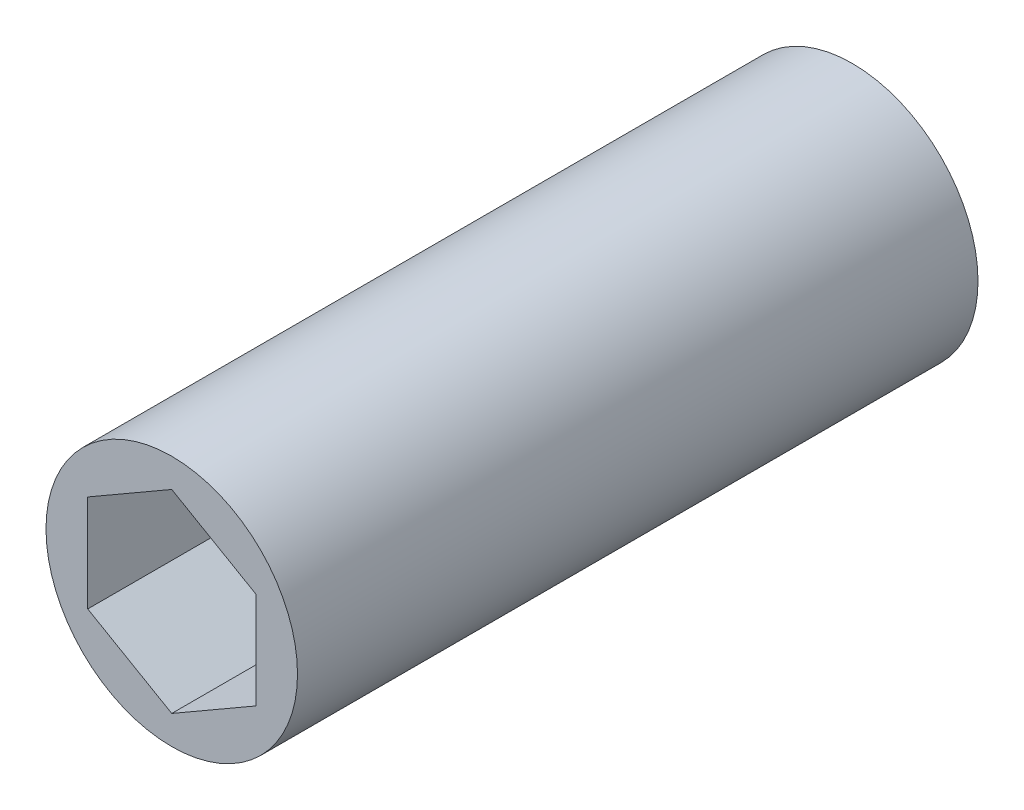
ISO-10303-21;
HEADER;
FILE_DESCRIPTION(('STEP AP214'),'2;1');
FILE_NAME('part.step','',(''),(''),'','','');
FILE_SCHEMA(('AUTOMOTIVE_DESIGN { 1 0 10303 214 1 1 1 1 }'));
ENDSEC;
DATA;
#1=APPLICATION_CONTEXT('core data for automotive mechanical design processes');
#2=APPLICATION_PROTOCOL_DEFINITION('international standard','automotive_design',2000,#1);
#3=PRODUCT_CONTEXT('',#1,'mechanical');
#4=PRODUCT('Part','Part','',(#3));
#5=PRODUCT_RELATED_PRODUCT_CATEGORY('part','',(#4));
#6=PRODUCT_DEFINITION_FORMATION('','',#4);
#7=PRODUCT_DEFINITION_CONTEXT('part definition',#1,'design');
#8=PRODUCT_DEFINITION('design','',#6,#7);
#9=PRODUCT_DEFINITION_SHAPE('','',#8);
#10=(LENGTH_UNIT() NAMED_UNIT(*) SI_UNIT(.MILLI.,.METRE.));
#11=(NAMED_UNIT(*) PLANE_ANGLE_UNIT() SI_UNIT($,.RADIAN.));
#12=(NAMED_UNIT(*) SI_UNIT($,.STERADIAN.) SOLID_ANGLE_UNIT());
#13=UNCERTAINTY_MEASURE_WITH_UNIT(LENGTH_MEASURE(1.E-05),#10,'distance_accuracy_value','');
#14=(GEOMETRIC_REPRESENTATION_CONTEXT(3) GLOBAL_UNCERTAINTY_ASSIGNED_CONTEXT((#13)) GLOBAL_UNIT_ASSIGNED_CONTEXT((#10,
#11,#12)) REPRESENTATION_CONTEXT('',''));
#15=CARTESIAN_POINT('',(0.,0.,0.));
#16=DIRECTION('',(0.,0.,1.));
#17=DIRECTION('',(1.,0.,0.));
#18=AXIS2_PLACEMENT_3D('',#15,#16,#17);
#19=CARTESIAN_POINT('',(0.,0.,25.772244042785));
#20=DIRECTION('',(0.,0.,1.));
#21=DIRECTION('',(1.,0.,0.));
#22=AXIS2_PLACEMENT_3D('',#19,#20,#21);
#23=PLANE('',#22);
#24=CARTESIAN_POINT('',(0.,0.,25.772244042785));
#25=DIRECTION('',(0.,0.,1.));
#26=DIRECTION('',(1.,0.,0.));
#27=AXIS2_PLACEMENT_3D('',#24,#25,#26);
#28=CIRCLE('',#27,9.525);
#29=CARTESIAN_POINT('',(9.525,0.,25.772244042785));
#30=VERTEX_POINT('',#29);
#31=EDGE_CURVE('E11',#30,#30,#28,.T.);
#32=ORIENTED_EDGE('',*,*,#31,.T.);
#33=EDGE_LOOP('',(#32));
#34=FACE_BOUND('',#33,.T.);
#35=DIRECTION('',(-0.866025403784439,0.5,0.));
#36=VECTOR('',#35,1.);
#37=CARTESIAN_POINT('',(6.3627,3.67350655777283,25.772244042785));
#38=LINE('',#37,#36);
#39=CARTESIAN_POINT('',(6.3627,3.67350655777283,25.772244042785));
#40=VERTEX_POINT('',#39);
#41=CARTESIAN_POINT('',(0.,7.34701311554566,25.772244042785));
#42=VERTEX_POINT('',#41);
#43=EDGE_CURVE('E106',#40,#42,#38,.T.);
#44=ORIENTED_EDGE('',*,*,#43,.F.);
#45=DIRECTION('',(0.,1.,0.));
#46=VECTOR('',#45,1.);
#47=CARTESIAN_POINT('',(6.3627,-3.67350655777283,25.772244042785));
#48=LINE('',#47,#46);
#49=CARTESIAN_POINT('',(6.3627,-3.67350655777283,25.772244042785));
#50=VERTEX_POINT('',#49);
#51=EDGE_CURVE('E97',#50,#40,#48,.T.);
#52=ORIENTED_EDGE('',*,*,#51,.F.);
#53=DIRECTION('',(0.866025403784439,0.5,0.));
#54=VECTOR('',#53,1.);
#55=CARTESIAN_POINT('',(0.,-7.34701311554566,25.772244042785));
#56=LINE('',#55,#54);
#57=CARTESIAN_POINT('',(0.,-7.34701311554566,25.772244042785));
#58=VERTEX_POINT('',#57);
#59=EDGE_CURVE('E131',#58,#50,#56,.T.);
#60=ORIENTED_EDGE('',*,*,#59,.F.);
#61=DIRECTION('',(0.866025403784439,-0.5,0.));
#62=VECTOR('',#61,1.);
#63=CARTESIAN_POINT('',(-6.3627,-3.67350655777283,25.772244042785));
#64=LINE('',#63,#62);
#65=CARTESIAN_POINT('',(-6.3627,-3.67350655777283,25.772244042785));
#66=VERTEX_POINT('',#65);
#67=EDGE_CURVE('E128',#66,#58,#64,.T.);
#68=ORIENTED_EDGE('',*,*,#67,.F.);
#69=DIRECTION('',(0.,-1.,0.));
#70=VECTOR('',#69,1.);
#71=CARTESIAN_POINT('',(-6.3627,3.67350655777283,25.772244042785));
#72=LINE('',#71,#70);
#73=CARTESIAN_POINT('',(-6.3627,3.67350655777283,25.772244042785));
#74=VERTEX_POINT('',#73);
#75=EDGE_CURVE('E123',#74,#66,#72,.T.);
#76=ORIENTED_EDGE('',*,*,#75,.F.);
#77=DIRECTION('',(-0.866025403784439,-0.5,0.));
#78=VECTOR('',#77,1.);
#79=CARTESIAN_POINT('',(0.,7.34701311554566,25.772244042785));
#80=LINE('',#79,#78);
#81=EDGE_CURVE('E119',#42,#74,#80,.T.);
#82=ORIENTED_EDGE('',*,*,#81,.F.);
#83=EDGE_LOOP('',(#44,#52,#60,#68,#76,#82));
#84=FACE_BOUND('',#83,.T.);
#85=ADVANCED_FACE('F43',(#34,#84),#23,.T.);
#86=CARTESIAN_POINT('',(0.,0.,-25.772244042785));
#87=DIRECTION('',(0.,0.,1.));
#88=DIRECTION('',(1.,0.,0.));
#89=AXIS2_PLACEMENT_3D('',#86,#87,#88);
#90=PLANE('',#89);
#91=CARTESIAN_POINT('',(0.,0.,-25.772244042785));
#92=DIRECTION('',(0.,0.,1.));
#93=DIRECTION('',(1.,0.,0.));
#94=AXIS2_PLACEMENT_3D('',#91,#92,#93);
#95=CIRCLE('',#94,9.525);
#96=CARTESIAN_POINT('',(9.525,0.,-25.772244042785));
#97=VERTEX_POINT('',#96);
#98=EDGE_CURVE('E47',#97,#97,#95,.T.);
#99=ORIENTED_EDGE('',*,*,#98,.F.);
#100=EDGE_LOOP('',(#99));
#101=FACE_BOUND('',#100,.T.);
#102=DIRECTION('',(0.,1.,0.));
#103=VECTOR('',#102,1.);
#104=CARTESIAN_POINT('',(6.3627,-3.67350655777283,-25.772244042785));
#105=LINE('',#104,#103);
#106=CARTESIAN_POINT('',(6.3627,-3.67350655777284,-25.772244042785));
#107=VERTEX_POINT('',#106);
#108=CARTESIAN_POINT('',(6.3627,3.67350655777283,-25.772244042785));
#109=VERTEX_POINT('',#108);
#110=EDGE_CURVE('E67',#107,#109,#105,.T.);
#111=ORIENTED_EDGE('',*,*,#110,.T.);
#112=DIRECTION('',(-0.866025403784439,0.5,0.));
#113=VECTOR('',#112,1.);
#114=CARTESIAN_POINT('',(6.3627,3.67350655777283,-25.772244042785));
#115=LINE('',#114,#113);
#116=CARTESIAN_POINT('',(0.,7.34701311554566,-25.772244042785));
#117=VERTEX_POINT('',#116);
#118=EDGE_CURVE('E113',#109,#117,#115,.T.);
#119=ORIENTED_EDGE('',*,*,#118,.T.);
#120=DIRECTION('',(-0.866025403784439,-0.5,0.));
#121=VECTOR('',#120,1.);
#122=CARTESIAN_POINT('',(0.,7.34701311554566,-25.772244042785));
#123=LINE('',#122,#121);
#124=CARTESIAN_POINT('',(-6.3627,3.67350655777283,-25.772244042785));
#125=VERTEX_POINT('',#124);
#126=EDGE_CURVE('E138',#117,#125,#123,.T.);
#127=ORIENTED_EDGE('',*,*,#126,.T.);
#128=DIRECTION('',(0.,-1.,0.));
#129=VECTOR('',#128,1.);
#130=CARTESIAN_POINT('',(-6.3627,3.67350655777283,-25.772244042785));
#131=LINE('',#130,#129);
#132=CARTESIAN_POINT('',(-6.3627,-3.67350655777283,-25.772244042785));
#133=VERTEX_POINT('',#132);
#134=EDGE_CURVE('E142',#125,#133,#131,.T.);
#135=ORIENTED_EDGE('',*,*,#134,.T.);
#136=DIRECTION('',(0.866025403784439,-0.5,0.));
#137=VECTOR('',#136,1.);
#138=CARTESIAN_POINT('',(-6.3627,-3.67350655777283,-25.772244042785));
#139=LINE('',#138,#137);
#140=CARTESIAN_POINT('',(0.,-7.34701311554566,-25.772244042785));
#141=VERTEX_POINT('',#140);
#142=EDGE_CURVE('E146',#133,#141,#139,.T.);
#143=ORIENTED_EDGE('',*,*,#142,.T.);
#144=DIRECTION('',(0.866025403784439,0.5,0.));
#145=VECTOR('',#144,1.);
#146=CARTESIAN_POINT('',(0.,-7.34701311554566,-25.772244042785));
#147=LINE('',#146,#145);
#148=EDGE_CURVE('E107',#141,#107,#147,.T.);
#149=ORIENTED_EDGE('',*,*,#148,.T.);
#150=EDGE_LOOP('',(#111,#119,#127,#135,#143,#149));
#151=FACE_BOUND('',#150,.T.);
#152=ADVANCED_FACE('F170',(#101,#151),#90,.F.);
#153=CARTESIAN_POINT('',(0.,0.,25.772244042785));
#154=DIRECTION('',(0.,0.,-1.));
#155=DIRECTION('',(-1.,0.,0.));
#156=AXIS2_PLACEMENT_3D('',#153,#154,#155);
#157=CYLINDRICAL_SURFACE('',#156,9.525);
#158=ORIENTED_EDGE('',*,*,#31,.F.);
#159=EDGE_LOOP('',(#158));
#160=FACE_BOUND('',#159,.T.);
#161=ORIENTED_EDGE('',*,*,#98,.T.);
#162=EDGE_LOOP('',(#161));
#163=FACE_BOUND('',#162,.T.);
#164=ADVANCED_FACE('F45',(#160,#163),#157,.T.);
#165=CARTESIAN_POINT('',(6.3627,-3.67350655777283,25.772244042785));
#166=DIRECTION('',(-1.,0.,0.));
#167=DIRECTION('',(0.,-1.,0.));
#168=AXIS2_PLACEMENT_3D('',#165,#166,#167);
#169=PLANE('',#168);
#170=ORIENTED_EDGE('',*,*,#110,.F.);
#171=DIRECTION('',(0.,0.,-1.));
#172=VECTOR('',#171,1.);
#173=CARTESIAN_POINT('',(6.3627,-3.67350655777283,25.772244042785));
#174=LINE('',#173,#172);
#175=EDGE_CURVE('E101',#50,#107,#174,.T.);
#176=ORIENTED_EDGE('',*,*,#175,.F.);
#177=ORIENTED_EDGE('',*,*,#51,.T.);
#178=DIRECTION('',(0.,0.,-1.));
#179=VECTOR('',#178,1.);
#180=CARTESIAN_POINT('',(6.3627,3.67350655777283,25.772244042785));
#181=LINE('',#180,#179);
#182=EDGE_CURVE('E100',#40,#109,#181,.T.);
#183=ORIENTED_EDGE('',*,*,#182,.T.);
#184=EDGE_LOOP('',(#170,#176,#177,#183));
#185=FACE_BOUND('',#184,.T.);
#186=ADVANCED_FACE('F99',(#185),#169,.T.);
#187=CARTESIAN_POINT('',(6.3627,3.67350655777283,25.772244042785));
#188=DIRECTION('',(-0.5,-0.866025403784439,0.));
#189=DIRECTION('',(0.866025403784439,-0.5,0.));
#190=AXIS2_PLACEMENT_3D('',#187,#188,#189);
#191=PLANE('',#190);
#192=ORIENTED_EDGE('',*,*,#118,.F.);
#193=ORIENTED_EDGE('',*,*,#182,.F.);
#194=ORIENTED_EDGE('',*,*,#43,.T.);
#195=DIRECTION('',(0.,0.,-1.));
#196=VECTOR('',#195,1.);
#197=CARTESIAN_POINT('',(0.,7.34701311554566,25.772244042785));
#198=LINE('',#197,#196);
#199=EDGE_CURVE('E115',#42,#117,#198,.T.);
#200=ORIENTED_EDGE('',*,*,#199,.T.);
#201=EDGE_LOOP('',(#192,#193,#194,#200));
#202=FACE_BOUND('',#201,.T.);
#203=ADVANCED_FACE('F110',(#202),#191,.T.);
#204=CARTESIAN_POINT('',(0.,7.34701311554566,25.772244042785));
#205=DIRECTION('',(0.5,-0.866025403784439,0.));
#206=DIRECTION('',(0.866025403784439,0.5,0.));
#207=AXIS2_PLACEMENT_3D('',#204,#205,#206);
#208=PLANE('',#207);
#209=ORIENTED_EDGE('',*,*,#126,.F.);
#210=ORIENTED_EDGE('',*,*,#199,.F.);
#211=ORIENTED_EDGE('',*,*,#81,.T.);
#212=DIRECTION('',(0.,0.,-1.));
#213=VECTOR('',#212,1.);
#214=CARTESIAN_POINT('',(-6.3627,3.67350655777283,25.772244042785));
#215=LINE('',#214,#213);
#216=EDGE_CURVE('E160',#74,#125,#215,.T.);
#217=ORIENTED_EDGE('',*,*,#216,.T.);
#218=EDGE_LOOP('',(#209,#210,#211,#217));
#219=FACE_BOUND('',#218,.T.);
#220=ADVANCED_FACE('F166',(#219),#208,.T.);
#221=CARTESIAN_POINT('',(-6.3627,3.67350655777283,25.772244042785));
#222=DIRECTION('',(1.,0.,0.));
#223=DIRECTION('',(0.,0.,-1.));
#224=AXIS2_PLACEMENT_3D('',#221,#222,#223);
#225=PLANE('',#224);
#226=ORIENTED_EDGE('',*,*,#134,.F.);
#227=ORIENTED_EDGE('',*,*,#216,.F.);
#228=ORIENTED_EDGE('',*,*,#75,.T.);
#229=DIRECTION('',(0.,0.,-1.));
#230=VECTOR('',#229,1.);
#231=CARTESIAN_POINT('',(-6.3627,-3.67350655777283,25.772244042785));
#232=LINE('',#231,#230);
#233=EDGE_CURVE('E157',#66,#133,#232,.T.);
#234=ORIENTED_EDGE('',*,*,#233,.T.);
#235=EDGE_LOOP('',(#226,#227,#228,#234));
#236=FACE_BOUND('',#235,.T.);
#237=ADVANCED_FACE('F178',(#236),#225,.T.);
#238=CARTESIAN_POINT('',(-6.3627,-3.67350655777283,25.772244042785));
#239=DIRECTION('',(0.5,0.866025403784439,0.));
#240=DIRECTION('',(-0.866025403784439,0.5,0.));
#241=AXIS2_PLACEMENT_3D('',#238,#239,#240);
#242=PLANE('',#241);
#243=ORIENTED_EDGE('',*,*,#142,.F.);
#244=ORIENTED_EDGE('',*,*,#233,.F.);
#245=ORIENTED_EDGE('',*,*,#67,.T.);
#246=DIRECTION('',(0.,0.,-1.));
#247=VECTOR('',#246,1.);
#248=CARTESIAN_POINT('',(0.,-7.34701311554566,25.772244042785));
#249=LINE('',#248,#247);
#250=EDGE_CURVE('E59',#58,#141,#249,.T.);
#251=ORIENTED_EDGE('',*,*,#250,.T.);
#252=EDGE_LOOP('',(#243,#244,#245,#251));
#253=FACE_BOUND('',#252,.T.);
#254=ADVANCED_FACE('F176',(#253),#242,.T.);
#255=CARTESIAN_POINT('',(0.,-7.34701311554566,25.772244042785));
#256=DIRECTION('',(-0.5,0.866025403784439,0.));
#257=DIRECTION('',(-0.866025403784439,-0.5,0.));
#258=AXIS2_PLACEMENT_3D('',#255,#256,#257);
#259=PLANE('',#258);
#260=ORIENTED_EDGE('',*,*,#148,.F.);
#261=ORIENTED_EDGE('',*,*,#250,.F.);
#262=ORIENTED_EDGE('',*,*,#59,.T.);
#263=ORIENTED_EDGE('',*,*,#175,.T.);
#264=EDGE_LOOP('',(#260,#261,#262,#263));
#265=FACE_BOUND('',#264,.T.);
#266=ADVANCED_FACE('F172',(#265),#259,.T.);
#267=CLOSED_SHELL('',(#85,#152,#164,#186,#203,#220,#237,#254,#266));
#268=MANIFOLD_SOLID_BREP('B2',#267);
#269=ADVANCED_BREP_SHAPE_REPRESENTATION('',(#18,#268),#14);
#270=SHAPE_DEFINITION_REPRESENTATION(#9,#269);
ENDSEC;
END-ISO-10303-21;
